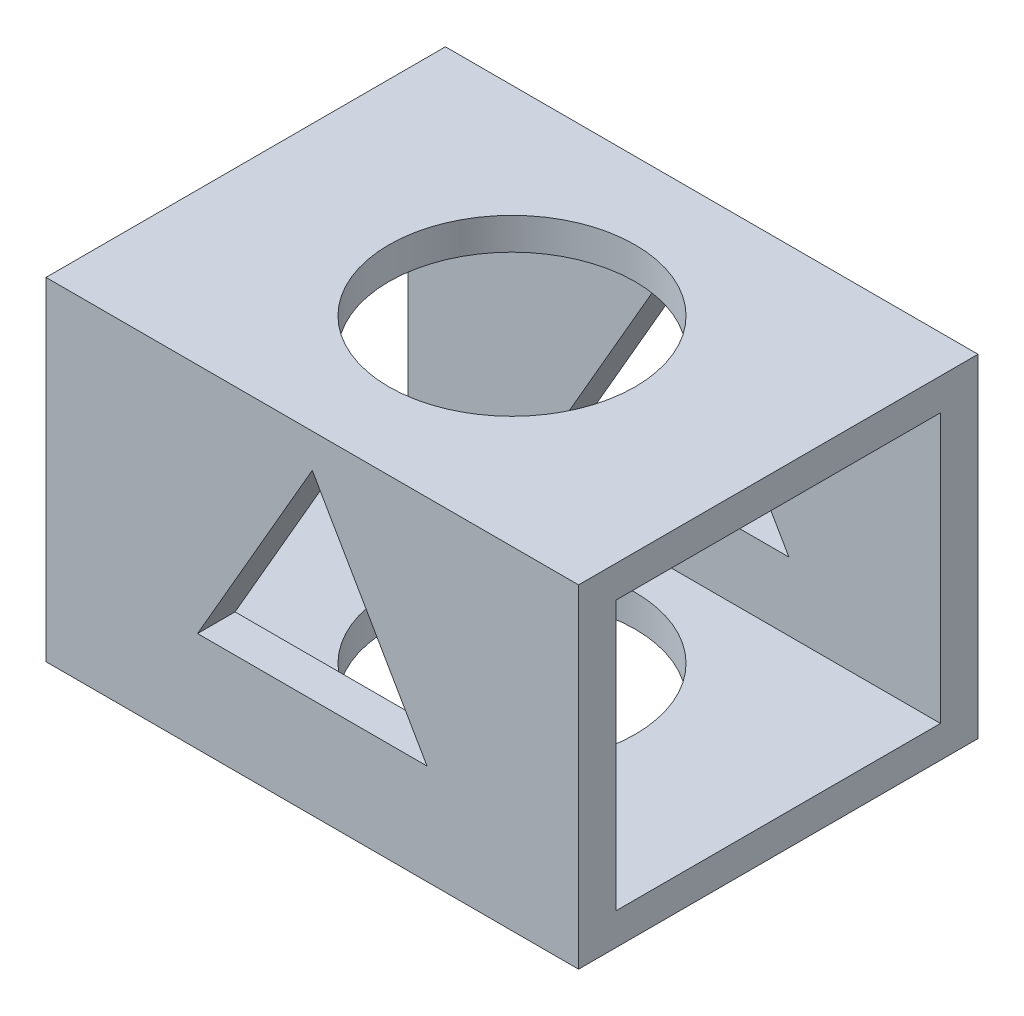
ISO-10303-21;
HEADER;
FILE_DESCRIPTION(('STEP AP214'),'2;1');
FILE_NAME('part.step','',(''),(''),'','','');
FILE_SCHEMA(('AUTOMOTIVE_DESIGN { 1 0 10303 214 1 1 1 1 }'));
ENDSEC;
DATA;
#1=APPLICATION_CONTEXT('core data for automotive mechanical design processes');
#2=APPLICATION_PROTOCOL_DEFINITION('international standard','automotive_design',2000,#1);
#3=PRODUCT_CONTEXT('',#1,'mechanical');
#4=PRODUCT('Part','Part','',(#3));
#5=PRODUCT_RELATED_PRODUCT_CATEGORY('part','',(#4));
#6=PRODUCT_DEFINITION_FORMATION('','',#4);
#7=PRODUCT_DEFINITION_CONTEXT('part definition',#1,'design');
#8=PRODUCT_DEFINITION('design','',#6,#7);
#9=PRODUCT_DEFINITION_SHAPE('','',#8);
#10=(LENGTH_UNIT() NAMED_UNIT(*) SI_UNIT(.MILLI.,.METRE.));
#11=(NAMED_UNIT(*) PLANE_ANGLE_UNIT() SI_UNIT($,.RADIAN.));
#12=(NAMED_UNIT(*) SI_UNIT($,.STERADIAN.) SOLID_ANGLE_UNIT());
#13=UNCERTAINTY_MEASURE_WITH_UNIT(LENGTH_MEASURE(1.E-05),#10,'distance_accuracy_value','');
#14=(GEOMETRIC_REPRESENTATION_CONTEXT(3) GLOBAL_UNCERTAINTY_ASSIGNED_CONTEXT((#13)) GLOBAL_UNIT_ASSIGNED_CONTEXT((#10,
#11,#12)) REPRESENTATION_CONTEXT('',''));
#15=CARTESIAN_POINT('',(0.,0.,0.));
#16=DIRECTION('',(0.,0.,1.));
#17=DIRECTION('',(1.,0.,0.));
#18=AXIS2_PLACEMENT_3D('',#15,#16,#17);
#19=CARTESIAN_POINT('',(43.7781022598842,-25.2752991243551,-76.2));
#20=DIRECTION('',(0.866025403784438,0.5,0.));
#21=DIRECTION('',(-0.5,0.866025403784438,0.));
#22=AXIS2_PLACEMENT_3D('',#19,#20,#21);
#23=PLANE('',#22);
#24=DIRECTION('',(0.,0.,1.));
#25=VECTOR('',#24,1.);
#26=CARTESIAN_POINT('',(43.7781022598842,-25.2752991243551,-76.2));
#27=LINE('',#26,#25);
#28=CARTESIAN_POINT('',(43.7781022598842,-25.2752991243551,-76.2));
#29=VERTEX_POINT('',#28);
#30=CARTESIAN_POINT('',(43.7781022598842,-25.2752991243551,-61.884513845509));
#31=VERTEX_POINT('',#30);
#32=EDGE_CURVE('E206',#29,#31,#27,.T.);
#33=ORIENTED_EDGE('',*,*,#32,.T.);
#34=DIRECTION('',(-0.5,0.866025403784438,0.));
#35=VECTOR('',#34,1.);
#36=CARTESIAN_POINT('',(43.7781022598842,-25.2752991243551,-61.884513845509));
#37=LINE('',#36,#35);
#38=CARTESIAN_POINT('',(0.,50.5505982487102,-61.884513845509));
#39=VERTEX_POINT('',#38);
#40=EDGE_CURVE('E184',#31,#39,#37,.T.);
#41=ORIENTED_EDGE('',*,*,#40,.T.);
#42=DIRECTION('',(0.,0.,1.));
#43=VECTOR('',#42,1.);
#44=CARTESIAN_POINT('',(0.,50.5505982487102,-76.2));
#45=LINE('',#44,#43);
#46=CARTESIAN_POINT('',(0.,50.5505982487102,-76.2));
#47=VERTEX_POINT('',#46);
#48=EDGE_CURVE('E215',#47,#39,#45,.T.);
#49=ORIENTED_EDGE('',*,*,#48,.F.);
#50=DIRECTION('',(-0.5,0.866025403784438,0.));
#51=VECTOR('',#50,1.);
#52=CARTESIAN_POINT('',(43.7781022598842,-25.2752991243551,-76.2));
#53=LINE('',#52,#51);
#54=EDGE_CURVE('E188',#29,#47,#53,.T.);
#55=ORIENTED_EDGE('',*,*,#54,.F.);
#56=EDGE_LOOP('',(#33,#41,#49,#55));
#57=FACE_BOUND('',#56,.T.);
#58=ADVANCED_FACE('F33',(#57),#23,.F.);
#59=CARTESIAN_POINT('',(-43.7781022598842,-25.2752991243551,-76.2));
#60=DIRECTION('',(0.,-1.,0.));
#61=DIRECTION('',(0.,0.,-1.));
#62=AXIS2_PLACEMENT_3D('',#59,#60,#61);
#63=PLANE('',#62);
#64=DIRECTION('',(0.,0.,1.));
#65=VECTOR('',#64,1.);
#66=CARTESIAN_POINT('',(-43.7781022598842,-25.2752991243551,-76.2));
#67=LINE('',#66,#65);
#68=CARTESIAN_POINT('',(-43.7781022598842,-25.2752991243551,-76.2));
#69=VERTEX_POINT('',#68);
#70=CARTESIAN_POINT('',(-43.7781022598842,-25.2752991243551,-61.884513845509));
#71=VERTEX_POINT('',#70);
#72=EDGE_CURVE('E211',#69,#71,#67,.T.);
#73=ORIENTED_EDGE('',*,*,#72,.T.);
#74=DIRECTION('',(1.,0.,0.));
#75=VECTOR('',#74,1.);
#76=CARTESIAN_POINT('',(-43.7781022598842,-25.2752991243551,-61.884513845509));
#77=LINE('',#76,#75);
#78=EDGE_CURVE('E181',#71,#31,#77,.T.);
#79=ORIENTED_EDGE('',*,*,#78,.T.);
#80=ORIENTED_EDGE('',*,*,#32,.F.);
#81=DIRECTION('',(1.,0.,0.));
#82=VECTOR('',#81,1.);
#83=CARTESIAN_POINT('',(-43.7781022598842,-25.2752991243551,-76.2));
#84=LINE('',#83,#82);
#85=EDGE_CURVE('E195',#69,#29,#84,.T.);
#86=ORIENTED_EDGE('',*,*,#85,.F.);
#87=EDGE_LOOP('',(#73,#79,#80,#86));
#88=FACE_BOUND('',#87,.T.);
#89=ADVANCED_FACE('F277',(#88),#63,.F.);
#90=CARTESIAN_POINT('',(0.,50.5505982487102,-76.2));
#91=DIRECTION('',(-0.866025403784439,0.5,0.));
#92=DIRECTION('',(-0.5,-0.866025403784439,0.));
#93=AXIS2_PLACEMENT_3D('',#90,#91,#92);
#94=PLANE('',#93);
#95=ORIENTED_EDGE('',*,*,#48,.T.);
#96=DIRECTION('',(-0.5,-0.866025403784439,0.));
#97=VECTOR('',#96,1.);
#98=CARTESIAN_POINT('',(0.,50.5505982487102,-61.884513845509));
#99=LINE('',#98,#97);
#100=EDGE_CURVE('E11',#39,#71,#99,.T.);
#101=ORIENTED_EDGE('',*,*,#100,.T.);
#102=ORIENTED_EDGE('',*,*,#72,.F.);
#103=DIRECTION('',(-0.5,-0.866025403784439,0.));
#104=VECTOR('',#103,1.);
#105=CARTESIAN_POINT('',(0.,50.5505982487102,-76.2));
#106=LINE('',#105,#104);
#107=EDGE_CURVE('E191',#47,#69,#106,.T.);
#108=ORIENTED_EDGE('',*,*,#107,.F.);
#109=EDGE_LOOP('',(#95,#101,#102,#108));
#110=FACE_BOUND('',#109,.T.);
#111=ADVANCED_FACE('F283',(#110),#94,.F.);
#112=CARTESIAN_POINT('',(101.6,-63.5,76.2));
#113=DIRECTION('',(-1.,0.,0.));
#114=DIRECTION('',(0.,0.,1.));
#115=AXIS2_PLACEMENT_3D('',#112,#113,#114);
#116=PLANE('',#115);
#117=DIRECTION('',(0.,0.,1.));
#118=VECTOR('',#117,1.);
#119=CARTESIAN_POINT('',(101.6,51.3319522360152,61.884513845509));
#120=LINE('',#119,#118);
#121=CARTESIAN_POINT('',(101.6,51.3319522360152,-61.884513845509));
#122=VERTEX_POINT('',#121);
#123=CARTESIAN_POINT('',(101.6,51.3319522360152,61.884513845509));
#124=VERTEX_POINT('',#123);
#125=EDGE_CURVE('E166',#122,#124,#120,.T.);
#126=ORIENTED_EDGE('',*,*,#125,.F.);
#127=DIRECTION('',(0.,1.,0.));
#128=VECTOR('',#127,1.);
#129=CARTESIAN_POINT('',(101.6,-51.3319522360152,-61.884513845509));
#130=LINE('',#129,#128);
#131=CARTESIAN_POINT('',(101.6,-51.3319522360152,-61.884513845509));
#132=VERTEX_POINT('',#131);
#133=EDGE_CURVE('E49',#132,#122,#130,.T.);
#134=ORIENTED_EDGE('',*,*,#133,.F.);
#135=DIRECTION('',(0.,0.,-1.));
#136=VECTOR('',#135,1.);
#137=CARTESIAN_POINT('',(101.6,-51.3319522360152,61.884513845509));
#138=LINE('',#137,#136);
#139=CARTESIAN_POINT('',(101.6,-51.3319522360152,61.884513845509));
#140=VERTEX_POINT('',#139);
#141=EDGE_CURVE('E154',#140,#132,#138,.T.);
#142=ORIENTED_EDGE('',*,*,#141,.F.);
#143=DIRECTION('',(0.,-1.,0.));
#144=VECTOR('',#143,1.);
#145=CARTESIAN_POINT('',(101.6,-51.3319522360152,61.884513845509));
#146=LINE('',#145,#144);
#147=EDGE_CURVE('E157',#124,#140,#146,.T.);
#148=ORIENTED_EDGE('',*,*,#147,.F.);
#149=EDGE_LOOP('',(#126,#134,#142,#148));
#150=FACE_BOUND('',#149,.T.);
#151=DIRECTION('',(0.,1.,0.));
#152=VECTOR('',#151,1.);
#153=CARTESIAN_POINT('',(101.6,-63.5,-76.2));
#154=LINE('',#153,#152);
#155=CARTESIAN_POINT('',(101.6,-63.5,-76.2));
#156=VERTEX_POINT('',#155);
#157=CARTESIAN_POINT('',(101.6,63.5,-76.2));
#158=VERTEX_POINT('',#157);
#159=EDGE_CURVE('E209',#156,#158,#154,.T.);
#160=ORIENTED_EDGE('',*,*,#159,.T.);
#161=DIRECTION('',(0.,0.,-1.));
#162=VECTOR('',#161,1.);
#163=CARTESIAN_POINT('',(101.6,63.5,76.2));
#164=LINE('',#163,#162);
#165=CARTESIAN_POINT('',(101.6,63.5,76.2));
#166=VERTEX_POINT('',#165);
#167=EDGE_CURVE('E244',#166,#158,#164,.T.);
#168=ORIENTED_EDGE('',*,*,#167,.F.);
#169=DIRECTION('',(0.,1.,0.));
#170=VECTOR('',#169,1.);
#171=CARTESIAN_POINT('',(101.6,-63.5,76.2));
#172=LINE('',#171,#170);
#173=CARTESIAN_POINT('',(101.6,-63.5,76.2));
#174=VERTEX_POINT('',#173);
#175=EDGE_CURVE('E218',#174,#166,#172,.T.);
#176=ORIENTED_EDGE('',*,*,#175,.F.);
#177=DIRECTION('',(0.,0.,-1.));
#178=VECTOR('',#177,1.);
#179=CARTESIAN_POINT('',(101.6,-63.5,76.2));
#180=LINE('',#179,#178);
#181=EDGE_CURVE('E228',#174,#156,#180,.T.);
#182=ORIENTED_EDGE('',*,*,#181,.T.);
#183=EDGE_LOOP('',(#160,#168,#176,#182));
#184=FACE_BOUND('',#183,.T.);
#185=ADVANCED_FACE('F35',(#150,#184),#116,.F.);
#186=CARTESIAN_POINT('',(-101.6,63.5,76.2));
#187=DIRECTION('',(0.,-1.,0.));
#188=DIRECTION('',(0.,0.,-1.));
#189=AXIS2_PLACEMENT_3D('',#186,#187,#188);
#190=PLANE('',#189);
#191=CARTESIAN_POINT('',(0.,63.5,0.));
#192=DIRECTION('',(0.,1.,0.));
#193=DIRECTION('',(0.,0.,1.));
#194=AXIS2_PLACEMENT_3D('',#191,#192,#193);
#195=CIRCLE('',#194,46.9608561348397);
#196=CARTESIAN_POINT('',(0.,63.5,46.9608561348397));
#197=VERTEX_POINT('',#196);
#198=EDGE_CURVE('E316',#197,#197,#195,.T.);
#199=ORIENTED_EDGE('',*,*,#198,.F.);
#200=EDGE_LOOP('',(#199));
#201=FACE_BOUND('',#200,.T.);
#202=DIRECTION('',(-1.,0.,0.));
#203=VECTOR('',#202,1.);
#204=CARTESIAN_POINT('',(-101.6,63.5,-76.2));
#205=LINE('',#204,#203);
#206=CARTESIAN_POINT('',(-101.6,63.5,-76.2));
#207=VERTEX_POINT('',#206);
#208=EDGE_CURVE('E231',#158,#207,#205,.T.);
#209=ORIENTED_EDGE('',*,*,#208,.T.);
#210=DIRECTION('',(0.,0.,-1.));
#211=VECTOR('',#210,1.);
#212=CARTESIAN_POINT('',(-101.6,63.5,76.2));
#213=LINE('',#212,#211);
#214=CARTESIAN_POINT('',(-101.6,63.5,76.2));
#215=VERTEX_POINT('',#214);
#216=EDGE_CURVE('E241',#215,#207,#213,.T.);
#217=ORIENTED_EDGE('',*,*,#216,.F.);
#218=DIRECTION('',(-1.,0.,0.));
#219=VECTOR('',#218,1.);
#220=CARTESIAN_POINT('',(-101.6,63.5,76.2));
#221=LINE('',#220,#219);
#222=EDGE_CURVE('E221',#166,#215,#221,.T.);
#223=ORIENTED_EDGE('',*,*,#222,.F.);
#224=ORIENTED_EDGE('',*,*,#167,.T.);
#225=EDGE_LOOP('',(#209,#217,#223,#224));
#226=FACE_BOUND('',#225,.T.);
#227=ADVANCED_FACE('F306',(#201,#226),#190,.F.);
#228=CARTESIAN_POINT('',(-101.6,-63.5,76.2));
#229=DIRECTION('',(1.,0.,0.));
#230=DIRECTION('',(0.,0.,-1.));
#231=AXIS2_PLACEMENT_3D('',#228,#229,#230);
#232=PLANE('',#231);
#233=DIRECTION('',(0.,0.,-1.));
#234=VECTOR('',#233,1.);
#235=CARTESIAN_POINT('',(-101.6,-51.3319522360152,61.884513845509));
#236=LINE('',#235,#234);
#237=CARTESIAN_POINT('',(-101.6,-51.3319522360152,61.884513845509));
#238=VERTEX_POINT('',#237);
#239=CARTESIAN_POINT('',(-101.6,-51.3319522360152,-61.884513845509));
#240=VERTEX_POINT('',#239);
#241=EDGE_CURVE('E144',#238,#240,#236,.T.);
#242=ORIENTED_EDGE('',*,*,#241,.T.);
#243=DIRECTION('',(0.,1.,0.));
#244=VECTOR('',#243,1.);
#245=CARTESIAN_POINT('',(-101.6,-51.3319522360152,-61.884513845509));
#246=LINE('',#245,#244);
#247=CARTESIAN_POINT('',(-101.6,51.3319522360152,-61.884513845509));
#248=VERTEX_POINT('',#247);
#249=EDGE_CURVE('E138',#240,#248,#246,.T.);
#250=ORIENTED_EDGE('',*,*,#249,.T.);
#251=DIRECTION('',(0.,0.,1.));
#252=VECTOR('',#251,1.);
#253=CARTESIAN_POINT('',(-101.6,51.3319522360152,61.884513845509));
#254=LINE('',#253,#252);
#255=CARTESIAN_POINT('',(-101.6,51.3319522360152,61.884513845509));
#256=VERTEX_POINT('',#255);
#257=EDGE_CURVE('E147',#248,#256,#254,.T.);
#258=ORIENTED_EDGE('',*,*,#257,.T.);
#259=DIRECTION('',(0.,-1.,0.));
#260=VECTOR('',#259,1.);
#261=CARTESIAN_POINT('',(-101.6,-51.3319522360152,61.884513845509));
#262=LINE('',#261,#260);
#263=EDGE_CURVE('E57',#256,#238,#262,.T.);
#264=ORIENTED_EDGE('',*,*,#263,.T.);
#265=EDGE_LOOP('',(#242,#250,#258,#264));
#266=FACE_BOUND('',#265,.T.);
#267=DIRECTION('',(0.,-1.,0.));
#268=VECTOR('',#267,1.);
#269=CARTESIAN_POINT('',(-101.6,-63.5,-76.2));
#270=LINE('',#269,#268);
#271=CARTESIAN_POINT('',(-101.6,-63.5,-76.2));
#272=VERTEX_POINT('',#271);
#273=EDGE_CURVE('E233',#207,#272,#270,.T.);
#274=ORIENTED_EDGE('',*,*,#273,.T.);
#275=DIRECTION('',(0.,0.,-1.));
#276=VECTOR('',#275,1.);
#277=CARTESIAN_POINT('',(-101.6,-63.5,76.2));
#278=LINE('',#277,#276);
#279=CARTESIAN_POINT('',(-101.6,-63.5,76.2));
#280=VERTEX_POINT('',#279);
#281=EDGE_CURVE('E238',#280,#272,#278,.T.);
#282=ORIENTED_EDGE('',*,*,#281,.F.);
#283=DIRECTION('',(0.,-1.,0.));
#284=VECTOR('',#283,1.);
#285=CARTESIAN_POINT('',(-101.6,-63.5,76.2));
#286=LINE('',#285,#284);
#287=EDGE_CURVE('E224',#215,#280,#286,.T.);
#288=ORIENTED_EDGE('',*,*,#287,.F.);
#289=ORIENTED_EDGE('',*,*,#216,.T.);
#290=EDGE_LOOP('',(#274,#282,#288,#289));
#291=FACE_BOUND('',#290,.T.);
#292=ADVANCED_FACE('F151',(#266,#291),#232,.F.);
#293=CARTESIAN_POINT('',(-101.6,-63.5,76.2));
#294=DIRECTION('',(0.,1.,0.));
#295=DIRECTION('',(0.,0.,1.));
#296=AXIS2_PLACEMENT_3D('',#293,#294,#295);
#297=PLANE('',#296);
#298=CARTESIAN_POINT('',(0.,-63.5,0.));
#299=DIRECTION('',(0.,1.,0.));
#300=DIRECTION('',(0.,0.,1.));
#301=AXIS2_PLACEMENT_3D('',#298,#299,#300);
#302=CIRCLE('',#301,46.9608561348397);
#303=CARTESIAN_POINT('',(0.,-63.5,46.9608561348397));
#304=VERTEX_POINT('',#303);
#305=EDGE_CURVE('E330',#304,#304,#302,.T.);
#306=ORIENTED_EDGE('',*,*,#305,.T.);
#307=EDGE_LOOP('',(#306));
#308=FACE_BOUND('',#307,.T.);
#309=DIRECTION('',(1.,0.,0.));
#310=VECTOR('',#309,1.);
#311=CARTESIAN_POINT('',(-101.6,-63.5,-76.2));
#312=LINE('',#311,#310);
#313=EDGE_CURVE('E222',#272,#156,#312,.T.);
#314=ORIENTED_EDGE('',*,*,#313,.T.);
#315=ORIENTED_EDGE('',*,*,#181,.F.);
#316=DIRECTION('',(1.,0.,0.));
#317=VECTOR('',#316,1.);
#318=CARTESIAN_POINT('',(-101.6,-63.5,76.2));
#319=LINE('',#318,#317);
#320=EDGE_CURVE('E226',#280,#174,#319,.T.);
#321=ORIENTED_EDGE('',*,*,#320,.F.);
#322=ORIENTED_EDGE('',*,*,#281,.T.);
#323=EDGE_LOOP('',(#314,#315,#321,#322));
#324=FACE_BOUND('',#323,.T.);
#325=ADVANCED_FACE('F299',(#308,#324),#297,.F.);
#326=CARTESIAN_POINT('',(0.,0.,76.2));
#327=DIRECTION('',(0.,0.,-1.));
#328=DIRECTION('',(-1.,0.,0.));
#329=AXIS2_PLACEMENT_3D('',#326,#327,#328);
#330=PLANE('',#329);
#331=DIRECTION('',(-0.5,-0.866025403784439,0.));
#332=VECTOR('',#331,1.);
#333=CARTESIAN_POINT('',(0.,50.5505982487102,76.2));
#334=LINE('',#333,#332);
#335=CARTESIAN_POINT('',(0.,50.5505982487102,76.2));
#336=VERTEX_POINT('',#335);
#337=CARTESIAN_POINT('',(-43.7781022598842,-25.2752991243551,76.2));
#338=VERTEX_POINT('',#337);
#339=EDGE_CURVE('E201',#336,#338,#334,.T.);
#340=ORIENTED_EDGE('',*,*,#339,.F.);
#341=DIRECTION('',(-0.5,0.866025403784438,0.));
#342=VECTOR('',#341,1.);
#343=CARTESIAN_POINT('',(43.7781022598842,-25.2752991243551,76.2));
#344=LINE('',#343,#342);
#345=CARTESIAN_POINT('',(43.7781022598842,-25.2752991243551,76.2));
#346=VERTEX_POINT('',#345);
#347=EDGE_CURVE('E187',#346,#336,#344,.T.);
#348=ORIENTED_EDGE('',*,*,#347,.F.);
#349=DIRECTION('',(1.,0.,0.));
#350=VECTOR('',#349,1.);
#351=CARTESIAN_POINT('',(-43.7781022598842,-25.2752991243551,76.2));
#352=LINE('',#351,#350);
#353=EDGE_CURVE('E192',#338,#346,#352,.T.);
#354=ORIENTED_EDGE('',*,*,#353,.F.);
#355=EDGE_LOOP('',(#340,#348,#354));
#356=FACE_BOUND('',#355,.T.);
#357=ORIENTED_EDGE('',*,*,#175,.T.);
#358=ORIENTED_EDGE('',*,*,#222,.T.);
#359=ORIENTED_EDGE('',*,*,#287,.T.);
#360=ORIENTED_EDGE('',*,*,#320,.T.);
#361=EDGE_LOOP('',(#357,#358,#359,#360));
#362=FACE_BOUND('',#361,.T.);
#363=ADVANCED_FACE('F260',(#356,#362),#330,.F.);
#364=CARTESIAN_POINT('',(0.,0.,-76.2));
#365=DIRECTION('',(0.,0.,-1.));
#366=DIRECTION('',(-1.,0.,0.));
#367=AXIS2_PLACEMENT_3D('',#364,#365,#366);
#368=PLANE('',#367);
#369=ORIENTED_EDGE('',*,*,#54,.T.);
#370=ORIENTED_EDGE('',*,*,#107,.T.);
#371=ORIENTED_EDGE('',*,*,#85,.T.);
#372=EDGE_LOOP('',(#369,#370,#371));
#373=FACE_BOUND('',#372,.T.);
#374=ORIENTED_EDGE('',*,*,#159,.F.);
#375=ORIENTED_EDGE('',*,*,#313,.F.);
#376=ORIENTED_EDGE('',*,*,#273,.F.);
#377=ORIENTED_EDGE('',*,*,#208,.F.);
#378=EDGE_LOOP('',(#374,#375,#376,#377));
#379=FACE_BOUND('',#378,.T.);
#380=ADVANCED_FACE('F289',(#373,#379),#368,.T.);
#381=CARTESIAN_POINT('',(0.,50.5505982487102,61.884513845509));
#382=VERTEX_POINT('',#381);
#383=EDGE_CURVE('E198',#382,#336,#45,.T.);
#384=ORIENTED_EDGE('',*,*,#383,.F.);
#385=DIRECTION('',(0.5,-0.866025403784438,0.));
#386=VECTOR('',#385,1.);
#387=CARTESIAN_POINT('',(43.7781022598842,-25.2752991243551,61.884513845509));
#388=LINE('',#387,#386);
#389=CARTESIAN_POINT('',(43.7781022598842,-25.2752991243551,61.884513845509));
#390=VERTEX_POINT('',#389);
#391=EDGE_CURVE('E178',#382,#390,#388,.T.);
#392=ORIENTED_EDGE('',*,*,#391,.T.);
#393=EDGE_CURVE('E210',#390,#346,#27,.T.);
#394=ORIENTED_EDGE('',*,*,#393,.T.);
#395=ORIENTED_EDGE('',*,*,#347,.T.);
#396=EDGE_LOOP('',(#384,#392,#394,#395));
#397=FACE_BOUND('',#396,.T.);
#398=ADVANCED_FACE('F254',(#397),#23,.F.);
#399=ORIENTED_EDGE('',*,*,#393,.F.);
#400=DIRECTION('',(-1.,0.,0.));
#401=VECTOR('',#400,1.);
#402=CARTESIAN_POINT('',(-43.7781022598842,-25.2752991243551,61.884513845509));
#403=LINE('',#402,#401);
#404=CARTESIAN_POINT('',(-43.7781022598842,-25.2752991243551,61.884513845509));
#405=VERTEX_POINT('',#404);
#406=EDGE_CURVE('E172',#390,#405,#403,.T.);
#407=ORIENTED_EDGE('',*,*,#406,.T.);
#408=EDGE_CURVE('E214',#405,#338,#67,.T.);
#409=ORIENTED_EDGE('',*,*,#408,.T.);
#410=ORIENTED_EDGE('',*,*,#353,.T.);
#411=EDGE_LOOP('',(#399,#407,#409,#410));
#412=FACE_BOUND('',#411,.T.);
#413=ADVANCED_FACE('F263',(#412),#63,.F.);
#414=ORIENTED_EDGE('',*,*,#408,.F.);
#415=DIRECTION('',(0.5,0.866025403784439,0.));
#416=VECTOR('',#415,1.);
#417=CARTESIAN_POINT('',(0.,50.5505982487102,61.884513845509));
#418=LINE('',#417,#416);
#419=EDGE_CURVE('E42',#405,#382,#418,.T.);
#420=ORIENTED_EDGE('',*,*,#419,.T.);
#421=ORIENTED_EDGE('',*,*,#383,.T.);
#422=ORIENTED_EDGE('',*,*,#339,.T.);
#423=EDGE_LOOP('',(#414,#420,#421,#422));
#424=FACE_BOUND('',#423,.T.);
#425=ADVANCED_FACE('F251',(#424),#94,.F.);
#426=CARTESIAN_POINT('',(-101.6,-51.3319522360152,-61.884513845509));
#427=DIRECTION('',(0.,0.,-1.));
#428=DIRECTION('',(-1.,0.,0.));
#429=AXIS2_PLACEMENT_3D('',#426,#427,#428);
#430=PLANE('',#429);
#431=ORIENTED_EDGE('',*,*,#133,.T.);
#432=DIRECTION('',(1.,0.,0.));
#433=VECTOR('',#432,1.);
#434=CARTESIAN_POINT('',(-101.6,51.3319522360152,-61.884513845509));
#435=LINE('',#434,#433);
#436=EDGE_CURVE('E133',#248,#122,#435,.T.);
#437=ORIENTED_EDGE('',*,*,#436,.F.);
#438=ORIENTED_EDGE('',*,*,#249,.F.);
#439=DIRECTION('',(1.,0.,0.));
#440=VECTOR('',#439,1.);
#441=CARTESIAN_POINT('',(-101.6,-51.3319522360152,-61.884513845509));
#442=LINE('',#441,#440);
#443=EDGE_CURVE('E170',#240,#132,#442,.T.);
#444=ORIENTED_EDGE('',*,*,#443,.T.);
#445=EDGE_LOOP('',(#431,#437,#438,#444));
#446=FACE_BOUND('',#445,.T.);
#447=ORIENTED_EDGE('',*,*,#78,.F.);
#448=ORIENTED_EDGE('',*,*,#100,.F.);
#449=ORIENTED_EDGE('',*,*,#40,.F.);
#450=EDGE_LOOP('',(#447,#448,#449));
#451=FACE_BOUND('',#450,.T.);
#452=ADVANCED_FACE('F135',(#446,#451),#430,.F.);
#453=CARTESIAN_POINT('',(-101.6,-51.3319522360152,61.884513845509));
#454=DIRECTION('',(0.,0.,1.));
#455=DIRECTION('',(1.,0.,0.));
#456=AXIS2_PLACEMENT_3D('',#453,#454,#455);
#457=PLANE('',#456);
#458=ORIENTED_EDGE('',*,*,#147,.T.);
#459=DIRECTION('',(1.,0.,0.));
#460=VECTOR('',#459,1.);
#461=CARTESIAN_POINT('',(-101.6,-51.3319522360152,61.884513845509));
#462=LINE('',#461,#460);
#463=EDGE_CURVE('E173',#238,#140,#462,.T.);
#464=ORIENTED_EDGE('',*,*,#463,.F.);
#465=ORIENTED_EDGE('',*,*,#263,.F.);
#466=DIRECTION('',(1.,0.,0.));
#467=VECTOR('',#466,1.);
#468=CARTESIAN_POINT('',(-101.6,51.3319522360152,61.884513845509));
#469=LINE('',#468,#467);
#470=EDGE_CURVE('E143',#256,#124,#469,.T.);
#471=ORIENTED_EDGE('',*,*,#470,.T.);
#472=EDGE_LOOP('',(#458,#464,#465,#471));
#473=FACE_BOUND('',#472,.T.);
#474=ORIENTED_EDGE('',*,*,#419,.F.);
#475=ORIENTED_EDGE('',*,*,#406,.F.);
#476=ORIENTED_EDGE('',*,*,#391,.F.);
#477=EDGE_LOOP('',(#474,#475,#476));
#478=FACE_BOUND('',#477,.T.);
#479=ADVANCED_FACE('F264',(#473,#478),#457,.F.);
#480=CARTESIAN_POINT('',(-101.6,-51.3319522360152,61.884513845509));
#481=DIRECTION('',(0.,-1.,0.));
#482=DIRECTION('',(0.,0.,-1.));
#483=AXIS2_PLACEMENT_3D('',#480,#481,#482);
#484=PLANE('',#483);
#485=CARTESIAN_POINT('',(0.,-51.3319522360152,0.));
#486=DIRECTION('',(0.,-1.,0.));
#487=DIRECTION('',(0.,0.,-1.));
#488=AXIS2_PLACEMENT_3D('',#485,#486,#487);
#489=CIRCLE('',#488,46.9608561348397);
#490=CARTESIAN_POINT('',(0.,-51.3319522360152,-46.9608561348397));
#491=VERTEX_POINT('',#490);
#492=EDGE_CURVE('E160',#491,#491,#489,.T.);
#493=ORIENTED_EDGE('',*,*,#492,.T.);
#494=EDGE_LOOP('',(#493));
#495=FACE_BOUND('',#494,.T.);
#496=ORIENTED_EDGE('',*,*,#141,.T.);
#497=ORIENTED_EDGE('',*,*,#443,.F.);
#498=ORIENTED_EDGE('',*,*,#241,.F.);
#499=ORIENTED_EDGE('',*,*,#463,.T.);
#500=EDGE_LOOP('',(#496,#497,#498,#499));
#501=FACE_BOUND('',#500,.T.);
#502=ADVANCED_FACE('F266',(#495,#501),#484,.F.);
#503=CARTESIAN_POINT('',(-101.6,51.3319522360152,61.884513845509));
#504=DIRECTION('',(0.,1.,0.));
#505=DIRECTION('',(0.,0.,1.));
#506=AXIS2_PLACEMENT_3D('',#503,#504,#505);
#507=PLANE('',#506);
#508=CARTESIAN_POINT('',(0.,51.3319522360152,0.));
#509=DIRECTION('',(0.,1.,0.));
#510=DIRECTION('',(0.,0.,1.));
#511=AXIS2_PLACEMENT_3D('',#508,#509,#510);
#512=CIRCLE('',#511,46.9608561348397);
#513=CARTESIAN_POINT('',(0.,51.3319522360152,46.9608561348397));
#514=VERTEX_POINT('',#513);
#515=EDGE_CURVE('E37',#514,#514,#512,.T.);
#516=ORIENTED_EDGE('',*,*,#515,.T.);
#517=EDGE_LOOP('',(#516));
#518=FACE_BOUND('',#517,.T.);
#519=ORIENTED_EDGE('',*,*,#125,.T.);
#520=ORIENTED_EDGE('',*,*,#470,.F.);
#521=ORIENTED_EDGE('',*,*,#257,.F.);
#522=ORIENTED_EDGE('',*,*,#436,.T.);
#523=EDGE_LOOP('',(#519,#520,#521,#522));
#524=FACE_BOUND('',#523,.T.);
#525=ADVANCED_FACE('F148',(#518,#524),#507,.F.);
#526=CARTESIAN_POINT('',(0.,-63.5,0.));
#527=DIRECTION('',(0.,1.,0.));
#528=DIRECTION('',(0.,0.,1.));
#529=AXIS2_PLACEMENT_3D('',#526,#527,#528);
#530=CYLINDRICAL_SURFACE('',#529,46.9608561348397);
#531=ORIENTED_EDGE('',*,*,#198,.T.);
#532=EDGE_LOOP('',(#531));
#533=FACE_BOUND('',#532,.T.);
#534=ORIENTED_EDGE('',*,*,#515,.F.);
#535=EDGE_LOOP('',(#534));
#536=FACE_BOUND('',#535,.T.);
#537=ADVANCED_FACE('F343',(#533,#536),#530,.F.);
#538=ORIENTED_EDGE('',*,*,#305,.F.);
#539=EDGE_LOOP('',(#538));
#540=FACE_BOUND('',#539,.T.);
#541=ORIENTED_EDGE('',*,*,#492,.F.);
#542=EDGE_LOOP('',(#541));
#543=FACE_BOUND('',#542,.T.);
#544=ADVANCED_FACE('F341',(#540,#543),#530,.F.);
#545=CLOSED_SHELL('',(#58,#89,#111,#185,#227,#292,#325,#363,#380,#398,#413,#425,#452,#479,#502,
#525,#537,#544));
#546=MANIFOLD_SOLID_BREP('B2',#545);
#547=ADVANCED_BREP_SHAPE_REPRESENTATION('',(#18,#546),#14);
#548=SHAPE_DEFINITION_REPRESENTATION(#9,#547);
ENDSEC;
END-ISO-10303-21;
